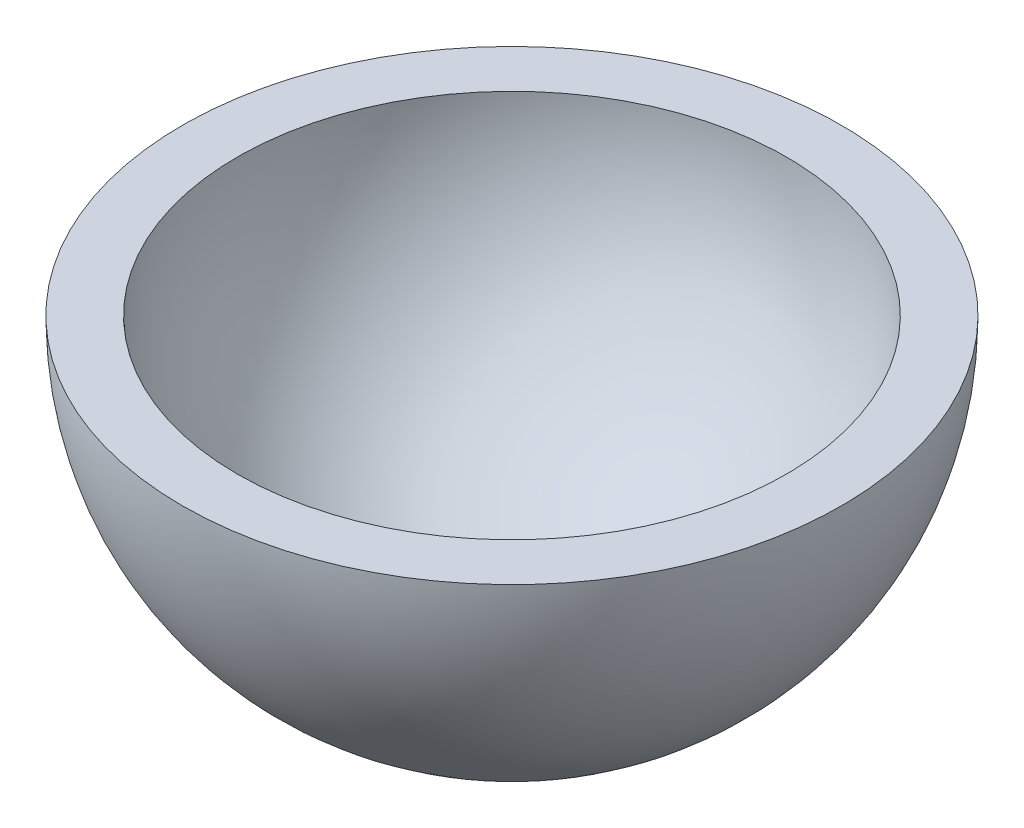
ISO-10303-21;
HEADER;
FILE_DESCRIPTION(('STEP AP214'),'2;1');
FILE_NAME('part.step','',(''),(''),'','','');
FILE_SCHEMA(('AUTOMOTIVE_DESIGN { 1 0 10303 214 1 1 1 1 }'));
ENDSEC;
DATA;
#1=APPLICATION_CONTEXT('core data for automotive mechanical design processes');
#2=APPLICATION_PROTOCOL_DEFINITION('international standard','automotive_design',2000,#1);
#3=PRODUCT_CONTEXT('',#1,'mechanical');
#4=PRODUCT('Part','Part','',(#3));
#5=PRODUCT_RELATED_PRODUCT_CATEGORY('part','',(#4));
#6=PRODUCT_DEFINITION_FORMATION('','',#4);
#7=PRODUCT_DEFINITION_CONTEXT('part definition',#1,'design');
#8=PRODUCT_DEFINITION('design','',#6,#7);
#9=PRODUCT_DEFINITION_SHAPE('','',#8);
#10=(LENGTH_UNIT() NAMED_UNIT(*) SI_UNIT(.MILLI.,.METRE.));
#11=(NAMED_UNIT(*) PLANE_ANGLE_UNIT() SI_UNIT($,.RADIAN.));
#12=(NAMED_UNIT(*) SI_UNIT($,.STERADIAN.) SOLID_ANGLE_UNIT());
#13=UNCERTAINTY_MEASURE_WITH_UNIT(LENGTH_MEASURE(1.E-05),#10,'distance_accuracy_value','');
#14=(GEOMETRIC_REPRESENTATION_CONTEXT(3) GLOBAL_UNCERTAINTY_ASSIGNED_CONTEXT((#13)) GLOBAL_UNIT_ASSIGNED_CONTEXT((#10,
#11,#12)) REPRESENTATION_CONTEXT('',''));
#15=CARTESIAN_POINT('',(0.,0.,0.));
#16=DIRECTION('',(0.,0.,1.));
#17=DIRECTION('',(1.,0.,0.));
#18=AXIS2_PLACEMENT_3D('',#15,#16,#17);
#19=CARTESIAN_POINT('',(0.,0.,0.));
#20=DIRECTION('',(0.,0.,-1.));
#21=DIRECTION('',(1.,0.,0.));
#22=AXIS2_PLACEMENT_3D('',#19,#20,#21);
#23=SPHERICAL_SURFACE('',#22,5.);
#24=CARTESIAN_POINT('',(0.,0.,0.));
#25=DIRECTION('',(0.,1.,0.));
#26=DIRECTION('',(0.,0.,1.));
#27=AXIS2_PLACEMENT_3D('',#24,#25,#26);
#28=SPHERICAL_SURFACE('',#27,5.);
#29=CARTESIAN_POINT('',(0.,0.,0.));
#30=DIRECTION('',(0.,1.,0.));
#31=DIRECTION('',(0.,0.,1.));
#32=AXIS2_PLACEMENT_3D('',#29,#30,#31);
#33=CIRCLE('',#32,5.);
#34=CARTESIAN_POINT('',(0.,0.,5.));
#35=VERTEX_POINT('',#34);
#36=EDGE_CURVE('E47',#35,#35,#33,.T.);
#37=ORIENTED_EDGE('',*,*,#36,.T.);
#38=EDGE_LOOP('',(#37));
#39=FACE_BOUND('',#38,.T.);
#40=ADVANCED_FACE('F39',(#39),#28,.F.);
#41=CARTESIAN_POINT('',(0.,0.,0.));
#42=DIRECTION('',(0.,0.,-1.));
#43=DIRECTION('',(-1.,0.,0.));
#44=AXIS2_PLACEMENT_3D('',#41,#42,#43);
#45=SPHERICAL_SURFACE('',#44,6.);
#46=CARTESIAN_POINT('',(0.,0.,0.));
#47=DIRECTION('',(0.,-1.,0.));
#48=DIRECTION('',(0.,0.,1.));
#49=AXIS2_PLACEMENT_3D('',#46,#47,#48);
#50=SPHERICAL_SURFACE('',#49,6.);
#51=CARTESIAN_POINT('',(0.,0.,0.));
#52=DIRECTION('',(0.,-1.,0.));
#53=DIRECTION('',(0.,0.,1.));
#54=AXIS2_PLACEMENT_3D('',#51,#52,#53);
#55=CIRCLE('',#54,6.);
#56=CARTESIAN_POINT('',(0.,0.,6.));
#57=VERTEX_POINT('',#56);
#58=EDGE_CURVE('E10',#57,#57,#55,.T.);
#59=ORIENTED_EDGE('',*,*,#58,.T.);
#60=EDGE_LOOP('',(#59));
#61=FACE_BOUND('',#60,.T.);
#62=ADVANCED_FACE('F41',(#61),#50,.T.);
#63=CARTESIAN_POINT('',(0.,0.,0.));
#64=DIRECTION('',(0.,-1.,0.));
#65=DIRECTION('',(0.,0.,1.));
#66=AXIS2_PLACEMENT_3D('',#63,#64,#65);
#67=PLANE('',#66);
#68=ORIENTED_EDGE('',*,*,#58,.F.);
#69=EDGE_LOOP('',(#68));
#70=FACE_BOUND('',#69,.T.);
#71=ORIENTED_EDGE('',*,*,#36,.F.);
#72=EDGE_LOOP('',(#71));
#73=FACE_BOUND('',#72,.T.);
#74=ADVANCED_FACE('F55',(#70,#73),#67,.F.);
#75=CLOSED_SHELL('',(#40,#62,#74));
#76=MANIFOLD_SOLID_BREP('B2',#75);
#77=ADVANCED_BREP_SHAPE_REPRESENTATION('',(#18,#76),#14);
#78=SHAPE_DEFINITION_REPRESENTATION(#9,#77);
ENDSEC;
END-ISO-10303-21;
